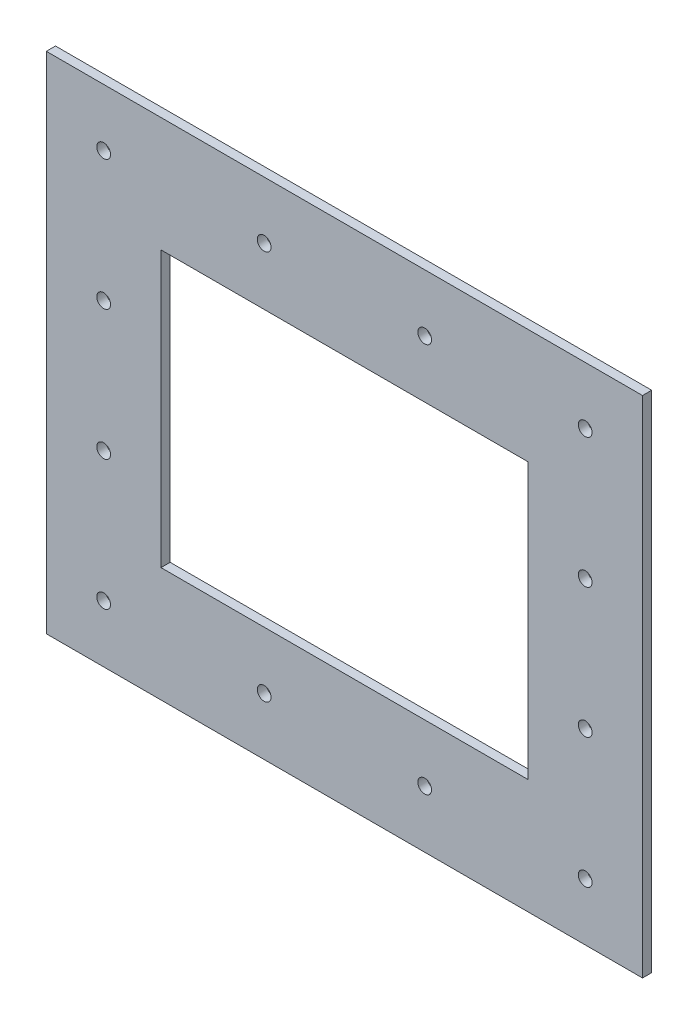
ISO-10303-21;
HEADER;
FILE_DESCRIPTION(('STEP AP214'),'2;1');
FILE_NAME('part.step','',(''),(''),'','','');
FILE_SCHEMA(('AUTOMOTIVE_DESIGN { 1 0 10303 214 1 1 1 1 }'));
ENDSEC;
DATA;
#1=APPLICATION_CONTEXT('core data for automotive mechanical design processes');
#2=APPLICATION_PROTOCOL_DEFINITION('international standard','automotive_design',2000,#1);
#3=PRODUCT_CONTEXT('',#1,'mechanical');
#4=PRODUCT('Part','Part','',(#3));
#5=PRODUCT_RELATED_PRODUCT_CATEGORY('part','',(#4));
#6=PRODUCT_DEFINITION_FORMATION('','',#4);
#7=PRODUCT_DEFINITION_CONTEXT('part definition',#1,'design');
#8=PRODUCT_DEFINITION('design','',#6,#7);
#9=PRODUCT_DEFINITION_SHAPE('','',#8);
#10=(LENGTH_UNIT() NAMED_UNIT(*) SI_UNIT(.MILLI.,.METRE.));
#11=(NAMED_UNIT(*) PLANE_ANGLE_UNIT() SI_UNIT($,.RADIAN.));
#12=(NAMED_UNIT(*) SI_UNIT($,.STERADIAN.) SOLID_ANGLE_UNIT());
#13=UNCERTAINTY_MEASURE_WITH_UNIT(LENGTH_MEASURE(1.E-05),#10,'distance_accuracy_value','');
#14=(GEOMETRIC_REPRESENTATION_CONTEXT(3) GLOBAL_UNCERTAINTY_ASSIGNED_CONTEXT((#13)) GLOBAL_UNIT_ASSIGNED_CONTEXT((#10,
#11,#12)) REPRESENTATION_CONTEXT('',''));
#15=CARTESIAN_POINT('',(0.,0.,0.));
#16=DIRECTION('',(0.,0.,1.));
#17=DIRECTION('',(1.,0.,0.));
#18=AXIS2_PLACEMENT_3D('',#15,#16,#17);
#19=CARTESIAN_POINT('',(0.,0.,2.));
#20=DIRECTION('',(0.,0.,-1.));
#21=DIRECTION('',(-1.,0.,0.));
#22=AXIS2_PLACEMENT_3D('',#19,#20,#21);
#23=PLANE('',#22);
#24=CARTESIAN_POINT('',(47.5000000000001,12.5,2.));
#25=DIRECTION('',(0.,0.,1.));
#26=DIRECTION('',(-1.,0.,0.));
#27=AXIS2_PLACEMENT_3D('',#24,#25,#26);
#28=CIRCLE('',#27,1.5);
#29=CARTESIAN_POINT('',(46.0000000000001,12.5,2.));
#30=VERTEX_POINT('',#29);
#31=EDGE_CURVE('E350',#30,#30,#28,.T.);
#32=ORIENTED_EDGE('',*,*,#31,.F.);
#33=EDGE_LOOP('',(#32));
#34=FACE_BOUND('',#33,.T.);
#35=CARTESIAN_POINT('',(82.5000000000002,12.5,2.));
#36=DIRECTION('',(0.,0.,1.));
#37=DIRECTION('',(-1.,0.,0.));
#38=AXIS2_PLACEMENT_3D('',#35,#36,#37);
#39=CIRCLE('',#38,1.5);
#40=CARTESIAN_POINT('',(81.0000000000002,12.5,2.));
#41=VERTEX_POINT('',#40);
#42=EDGE_CURVE('E342',#41,#41,#39,.T.);
#43=ORIENTED_EDGE('',*,*,#42,.F.);
#44=EDGE_LOOP('',(#43));
#45=FACE_BOUND('',#44,.T.);
#46=CARTESIAN_POINT('',(12.5000000000007,40.84,2.));
#47=DIRECTION('',(0.,0.,1.));
#48=DIRECTION('',(1.,0.,0.));
#49=AXIS2_PLACEMENT_3D('',#46,#47,#48);
#50=CIRCLE('',#49,1.5);
#51=CARTESIAN_POINT('',(14.0000000000007,40.84,2.));
#52=VERTEX_POINT('',#51);
#53=EDGE_CURVE('E334',#52,#52,#50,.T.);
#54=ORIENTED_EDGE('',*,*,#53,.F.);
#55=EDGE_LOOP('',(#54));
#56=FACE_BOUND('',#55,.T.);
#57=CARTESIAN_POINT('',(12.5000000000004,69.17,2.));
#58=DIRECTION('',(0.,0.,1.));
#59=DIRECTION('',(1.,0.,0.));
#60=AXIS2_PLACEMENT_3D('',#57,#58,#59);
#61=CIRCLE('',#60,1.5);
#62=CARTESIAN_POINT('',(14.0000000000004,69.17,2.));
#63=VERTEX_POINT('',#62);
#64=EDGE_CURVE('E325',#63,#63,#61,.T.);
#65=ORIENTED_EDGE('',*,*,#64,.F.);
#66=EDGE_LOOP('',(#65));
#67=FACE_BOUND('',#66,.T.);
#68=CARTESIAN_POINT('',(117.5,12.5,2.));
#69=DIRECTION('',(0.,0.,1.));
#70=DIRECTION('',(-1.,0.,0.));
#71=AXIS2_PLACEMENT_3D('',#68,#69,#70);
#72=CIRCLE('',#71,1.5);
#73=CARTESIAN_POINT('',(116.,12.5,2.));
#74=VERTEX_POINT('',#73);
#75=EDGE_CURVE('E373',#74,#74,#72,.T.);
#76=ORIENTED_EDGE('',*,*,#75,.F.);
#77=EDGE_LOOP('',(#76));
#78=FACE_BOUND('',#77,.T.);
#79=CARTESIAN_POINT('',(47.5000000000001,97.5,2.));
#80=DIRECTION('',(0.,0.,1.));
#81=DIRECTION('',(1.,0.,0.));
#82=AXIS2_PLACEMENT_3D('',#79,#80,#81);
#83=CIRCLE('',#82,1.5);
#84=CARTESIAN_POINT('',(49.0000000000001,97.5,2.));
#85=VERTEX_POINT('',#84);
#86=EDGE_CURVE('E382',#85,#85,#83,.T.);
#87=ORIENTED_EDGE('',*,*,#86,.F.);
#88=EDGE_LOOP('',(#87));
#89=FACE_BOUND('',#88,.T.);
#90=CARTESIAN_POINT('',(82.5000000000001,97.5,2.));
#91=DIRECTION('',(0.,0.,1.));
#92=DIRECTION('',(1.,0.,0.));
#93=AXIS2_PLACEMENT_3D('',#90,#91,#92);
#94=CIRCLE('',#93,1.5);
#95=CARTESIAN_POINT('',(84.0000000000001,97.5,2.));
#96=VERTEX_POINT('',#95);
#97=EDGE_CURVE('E357',#96,#96,#94,.T.);
#98=ORIENTED_EDGE('',*,*,#97,.F.);
#99=EDGE_LOOP('',(#98));
#100=FACE_BOUND('',#99,.T.);
#101=CARTESIAN_POINT('',(117.5,97.5,2.));
#102=DIRECTION('',(0.,0.,1.));
#103=DIRECTION('',(1.,0.,0.));
#104=AXIS2_PLACEMENT_3D('',#101,#102,#103);
#105=CIRCLE('',#104,1.5);
#106=CARTESIAN_POINT('',(119.,97.5,2.));
#107=VERTEX_POINT('',#106);
#108=EDGE_CURVE('E366',#107,#107,#105,.T.);
#109=ORIENTED_EDGE('',*,*,#108,.F.);
#110=EDGE_LOOP('',(#109));
#111=FACE_BOUND('',#110,.T.);
#112=CARTESIAN_POINT('',(12.5000000000001,12.5,2.));
#113=DIRECTION('',(0.,0.,1.));
#114=DIRECTION('',(-1.,0.,0.));
#115=AXIS2_PLACEMENT_3D('',#112,#113,#114);
#116=CIRCLE('',#115,1.5);
#117=CARTESIAN_POINT('',(11.0000000000001,12.5,2.));
#118=VERTEX_POINT('',#117);
#119=EDGE_CURVE('E298',#118,#118,#116,.T.);
#120=ORIENTED_EDGE('',*,*,#119,.F.);
#121=EDGE_LOOP('',(#120));
#122=FACE_BOUND('',#121,.T.);
#123=CARTESIAN_POINT('',(117.499999999999,40.84,2.));
#124=DIRECTION('',(0.,0.,1.));
#125=DIRECTION('',(-1.,0.,0.));
#126=AXIS2_PLACEMENT_3D('',#123,#124,#125);
#127=CIRCLE('',#126,1.50000000000001);
#128=CARTESIAN_POINT('',(115.999999999999,40.84,2.));
#129=VERTEX_POINT('',#128);
#130=EDGE_CURVE('E304',#129,#129,#127,.T.);
#131=ORIENTED_EDGE('',*,*,#130,.F.);
#132=EDGE_LOOP('',(#131));
#133=FACE_BOUND('',#132,.T.);
#134=CARTESIAN_POINT('',(117.5,69.17,2.));
#135=DIRECTION('',(0.,0.,1.));
#136=DIRECTION('',(-1.,0.,0.));
#137=AXIS2_PLACEMENT_3D('',#134,#135,#136);
#138=CIRCLE('',#137,1.5);
#139=CARTESIAN_POINT('',(116.,69.17,2.));
#140=VERTEX_POINT('',#139);
#141=EDGE_CURVE('E317',#140,#140,#138,.T.);
#142=ORIENTED_EDGE('',*,*,#141,.F.);
#143=EDGE_LOOP('',(#142));
#144=FACE_BOUND('',#143,.T.);
#145=CARTESIAN_POINT('',(12.5000000000001,97.5,2.));
#146=DIRECTION('',(0.,0.,1.));
#147=DIRECTION('',(1.,0.,0.));
#148=AXIS2_PLACEMENT_3D('',#145,#146,#147);
#149=CIRCLE('',#148,1.5);
#150=CARTESIAN_POINT('',(14.0000000000001,97.5,2.));
#151=VERTEX_POINT('',#150);
#152=EDGE_CURVE('E139',#151,#151,#149,.T.);
#153=ORIENTED_EDGE('',*,*,#152,.F.);
#154=EDGE_LOOP('',(#153));
#155=FACE_BOUND('',#154,.T.);
#156=DIRECTION('',(0.,-1.,0.));
#157=VECTOR('',#156,1.);
#158=CARTESIAN_POINT('',(0.,0.,2.));
#159=LINE('',#158,#157);
#160=CARTESIAN_POINT('',(0.,110.,2.));
#161=VERTEX_POINT('',#160);
#162=CARTESIAN_POINT('',(0.,0.,2.));
#163=VERTEX_POINT('',#162);
#164=EDGE_CURVE('E155',#161,#163,#159,.T.);
#165=ORIENTED_EDGE('',*,*,#164,.T.);
#166=DIRECTION('',(1.,0.,0.));
#167=VECTOR('',#166,1.);
#168=CARTESIAN_POINT('',(0.,0.,2.));
#169=LINE('',#168,#167);
#170=CARTESIAN_POINT('',(130.,0.,2.));
#171=VERTEX_POINT('',#170);
#172=EDGE_CURVE('E159',#163,#171,#169,.T.);
#173=ORIENTED_EDGE('',*,*,#172,.T.);
#174=DIRECTION('',(0.,1.,0.));
#175=VECTOR('',#174,1.);
#176=CARTESIAN_POINT('',(130.,0.,2.));
#177=LINE('',#176,#175);
#178=CARTESIAN_POINT('',(130.,110.,2.));
#179=VERTEX_POINT('',#178);
#180=EDGE_CURVE('E163',#171,#179,#177,.T.);
#181=ORIENTED_EDGE('',*,*,#180,.T.);
#182=DIRECTION('',(-1.,0.,0.));
#183=VECTOR('',#182,1.);
#184=CARTESIAN_POINT('',(0.,110.,2.));
#185=LINE('',#184,#183);
#186=EDGE_CURVE('E166',#179,#161,#185,.T.);
#187=ORIENTED_EDGE('',*,*,#186,.T.);
#188=EDGE_LOOP('',(#165,#173,#181,#187));
#189=FACE_BOUND('',#188,.T.);
#190=DIRECTION('',(1.,0.,0.));
#191=VECTOR('',#190,1.);
#192=CARTESIAN_POINT('',(25.,25.,2.));
#193=LINE('',#192,#191);
#194=CARTESIAN_POINT('',(25.,25.,2.));
#195=VERTEX_POINT('',#194);
#196=CARTESIAN_POINT('',(105.,25.,2.));
#197=VERTEX_POINT('',#196);
#198=EDGE_CURVE('E105',#195,#197,#193,.T.);
#199=ORIENTED_EDGE('',*,*,#198,.F.);
#200=DIRECTION('',(0.,-1.,0.));
#201=VECTOR('',#200,1.);
#202=CARTESIAN_POINT('',(25.,25.,2.));
#203=LINE('',#202,#201);
#204=CARTESIAN_POINT('',(25.,85.,2.));
#205=VERTEX_POINT('',#204);
#206=EDGE_CURVE('E131',#205,#195,#203,.T.);
#207=ORIENTED_EDGE('',*,*,#206,.F.);
#208=DIRECTION('',(-1.,0.,0.));
#209=VECTOR('',#208,1.);
#210=CARTESIAN_POINT('',(25.,85.,2.));
#211=LINE('',#210,#209);
#212=CARTESIAN_POINT('',(105.,85.,2.));
#213=VERTEX_POINT('',#212);
#214=EDGE_CURVE('E127',#213,#205,#211,.T.);
#215=ORIENTED_EDGE('',*,*,#214,.F.);
#216=DIRECTION('',(0.,1.,0.));
#217=VECTOR('',#216,1.);
#218=CARTESIAN_POINT('',(105.,25.,2.));
#219=LINE('',#218,#217);
#220=EDGE_CURVE('E114',#197,#213,#219,.T.);
#221=ORIENTED_EDGE('',*,*,#220,.F.);
#222=EDGE_LOOP('',(#199,#207,#215,#221));
#223=FACE_BOUND('',#222,.T.);
#224=ADVANCED_FACE('F39',(#34,#45,#56,#67,#78,#89,#100,#111,#122,#133,#144,#155,#189,#223),#23,.F.);
#225=CARTESIAN_POINT('',(0.,0.,0.));
#226=DIRECTION('',(0.,0.,-1.));
#227=DIRECTION('',(-1.,0.,0.));
#228=AXIS2_PLACEMENT_3D('',#225,#226,#227);
#229=PLANE('',#228);
#230=CARTESIAN_POINT('',(47.5000000000001,12.5,0.));
#231=DIRECTION('',(0.,0.,1.));
#232=DIRECTION('',(-1.,0.,0.));
#233=AXIS2_PLACEMENT_3D('',#230,#231,#232);
#234=CIRCLE('',#233,1.5);
#235=CARTESIAN_POINT('',(46.0000000000001,12.5,0.));
#236=VERTEX_POINT('',#235);
#237=EDGE_CURVE('E308',#236,#236,#234,.T.);
#238=ORIENTED_EDGE('',*,*,#237,.T.);
#239=EDGE_LOOP('',(#238));
#240=FACE_BOUND('',#239,.T.);
#241=CARTESIAN_POINT('',(82.5000000000002,12.5,0.));
#242=DIRECTION('',(0.,0.,1.));
#243=DIRECTION('',(-1.,0.,0.));
#244=AXIS2_PLACEMENT_3D('',#241,#242,#243);
#245=CIRCLE('',#244,1.5);
#246=CARTESIAN_POINT('',(81.0000000000002,12.5,0.));
#247=VERTEX_POINT('',#246);
#248=EDGE_CURVE('E346',#247,#247,#245,.T.);
#249=ORIENTED_EDGE('',*,*,#248,.T.);
#250=EDGE_LOOP('',(#249));
#251=FACE_BOUND('',#250,.T.);
#252=CARTESIAN_POINT('',(12.5000000000007,40.84,0.));
#253=DIRECTION('',(0.,0.,1.));
#254=DIRECTION('',(1.,0.,0.));
#255=AXIS2_PLACEMENT_3D('',#252,#253,#254);
#256=CIRCLE('',#255,1.5);
#257=CARTESIAN_POINT('',(14.0000000000007,40.84,0.));
#258=VERTEX_POINT('',#257);
#259=EDGE_CURVE('E338',#258,#258,#256,.T.);
#260=ORIENTED_EDGE('',*,*,#259,.T.);
#261=EDGE_LOOP('',(#260));
#262=FACE_BOUND('',#261,.T.);
#263=CARTESIAN_POINT('',(12.5000000000004,69.17,0.));
#264=DIRECTION('',(0.,0.,1.));
#265=DIRECTION('',(1.,0.,0.));
#266=AXIS2_PLACEMENT_3D('',#263,#264,#265);
#267=CIRCLE('',#266,1.5);
#268=CARTESIAN_POINT('',(14.0000000000004,69.17,0.));
#269=VERTEX_POINT('',#268);
#270=EDGE_CURVE('E330',#269,#269,#267,.T.);
#271=ORIENTED_EDGE('',*,*,#270,.T.);
#272=EDGE_LOOP('',(#271));
#273=FACE_BOUND('',#272,.T.);
#274=CARTESIAN_POINT('',(117.5,12.5,0.));
#275=DIRECTION('',(0.,0.,1.));
#276=DIRECTION('',(-1.,0.,0.));
#277=AXIS2_PLACEMENT_3D('',#274,#275,#276);
#278=CIRCLE('',#277,1.5);
#279=CARTESIAN_POINT('',(116.,12.5,0.));
#280=VERTEX_POINT('',#279);
#281=EDGE_CURVE('E378',#280,#280,#278,.T.);
#282=ORIENTED_EDGE('',*,*,#281,.T.);
#283=EDGE_LOOP('',(#282));
#284=FACE_BOUND('',#283,.T.);
#285=CARTESIAN_POINT('',(47.5000000000001,97.5,0.));
#286=DIRECTION('',(0.,0.,1.));
#287=DIRECTION('',(1.,0.,0.));
#288=AXIS2_PLACEMENT_3D('',#285,#286,#287);
#289=CIRCLE('',#288,1.5);
#290=CARTESIAN_POINT('',(49.0000000000001,97.5,0.));
#291=VERTEX_POINT('',#290);
#292=EDGE_CURVE('E361',#291,#291,#289,.T.);
#293=ORIENTED_EDGE('',*,*,#292,.T.);
#294=EDGE_LOOP('',(#293));
#295=FACE_BOUND('',#294,.T.);
#296=CARTESIAN_POINT('',(82.5000000000001,97.5,0.));
#297=DIRECTION('',(0.,0.,1.));
#298=DIRECTION('',(1.,0.,0.));
#299=AXIS2_PLACEMENT_3D('',#296,#297,#298);
#300=CIRCLE('',#299,1.5);
#301=CARTESIAN_POINT('',(84.0000000000001,97.5,0.));
#302=VERTEX_POINT('',#301);
#303=EDGE_CURVE('E362',#302,#302,#300,.T.);
#304=ORIENTED_EDGE('',*,*,#303,.T.);
#305=EDGE_LOOP('',(#304));
#306=FACE_BOUND('',#305,.T.);
#307=CARTESIAN_POINT('',(117.5,97.5,0.));
#308=DIRECTION('',(0.,0.,1.));
#309=DIRECTION('',(1.,0.,0.));
#310=AXIS2_PLACEMENT_3D('',#307,#308,#309);
#311=CIRCLE('',#310,1.5);
#312=CARTESIAN_POINT('',(119.,97.5,0.));
#313=VERTEX_POINT('',#312);
#314=EDGE_CURVE('E329',#313,#313,#311,.T.);
#315=ORIENTED_EDGE('',*,*,#314,.T.);
#316=EDGE_LOOP('',(#315));
#317=FACE_BOUND('',#316,.T.);
#318=CARTESIAN_POINT('',(12.5000000000001,12.5,0.));
#319=DIRECTION('',(0.,0.,1.));
#320=DIRECTION('',(-1.,0.,0.));
#321=AXIS2_PLACEMENT_3D('',#318,#319,#320);
#322=CIRCLE('',#321,1.5);
#323=CARTESIAN_POINT('',(11.0000000000001,12.5,0.));
#324=VERTEX_POINT('',#323);
#325=EDGE_CURVE('E301',#324,#324,#322,.T.);
#326=ORIENTED_EDGE('',*,*,#325,.T.);
#327=EDGE_LOOP('',(#326));
#328=FACE_BOUND('',#327,.T.);
#329=CARTESIAN_POINT('',(117.499999999999,40.84,0.));
#330=DIRECTION('',(0.,0.,1.));
#331=DIRECTION('',(-1.,0.,0.));
#332=AXIS2_PLACEMENT_3D('',#329,#330,#331);
#333=CIRCLE('',#332,1.50000000000001);
#334=CARTESIAN_POINT('',(115.999999999999,40.84,0.));
#335=VERTEX_POINT('',#334);
#336=EDGE_CURVE('E311',#335,#335,#333,.T.);
#337=ORIENTED_EDGE('',*,*,#336,.T.);
#338=EDGE_LOOP('',(#337));
#339=FACE_BOUND('',#338,.T.);
#340=CARTESIAN_POINT('',(117.5,69.17,0.));
#341=DIRECTION('',(0.,0.,1.));
#342=DIRECTION('',(-1.,0.,0.));
#343=AXIS2_PLACEMENT_3D('',#340,#341,#342);
#344=CIRCLE('',#343,1.5);
#345=CARTESIAN_POINT('',(116.,69.17,0.));
#346=VERTEX_POINT('',#345);
#347=EDGE_CURVE('E321',#346,#346,#344,.T.);
#348=ORIENTED_EDGE('',*,*,#347,.T.);
#349=EDGE_LOOP('',(#348));
#350=FACE_BOUND('',#349,.T.);
#351=CARTESIAN_POINT('',(12.5000000000001,97.5,0.));
#352=DIRECTION('',(0.,0.,1.));
#353=DIRECTION('',(1.,0.,0.));
#354=AXIS2_PLACEMENT_3D('',#351,#352,#353);
#355=CIRCLE('',#354,1.5);
#356=CARTESIAN_POINT('',(14.0000000000001,97.5,0.));
#357=VERTEX_POINT('',#356);
#358=EDGE_CURVE('E377',#357,#357,#355,.T.);
#359=ORIENTED_EDGE('',*,*,#358,.T.);
#360=EDGE_LOOP('',(#359));
#361=FACE_BOUND('',#360,.T.);
#362=DIRECTION('',(0.,-1.,0.));
#363=VECTOR('',#362,1.);
#364=CARTESIAN_POINT('',(0.,0.,0.));
#365=LINE('',#364,#363);
#366=CARTESIAN_POINT('',(0.,110.,0.));
#367=VERTEX_POINT('',#366);
#368=CARTESIAN_POINT('',(0.,0.,0.));
#369=VERTEX_POINT('',#368);
#370=EDGE_CURVE('E123',#367,#369,#365,.T.);
#371=ORIENTED_EDGE('',*,*,#370,.F.);
#372=DIRECTION('',(-1.,0.,0.));
#373=VECTOR('',#372,1.);
#374=CARTESIAN_POINT('',(0.,110.,0.));
#375=LINE('',#374,#373);
#376=CARTESIAN_POINT('',(130.,110.,0.));
#377=VERTEX_POINT('',#376);
#378=EDGE_CURVE('E160',#377,#367,#375,.T.);
#379=ORIENTED_EDGE('',*,*,#378,.F.);
#380=DIRECTION('',(0.,1.,0.));
#381=VECTOR('',#380,1.);
#382=CARTESIAN_POINT('',(130.,0.,0.));
#383=LINE('',#382,#381);
#384=CARTESIAN_POINT('',(130.,0.,0.));
#385=VERTEX_POINT('',#384);
#386=EDGE_CURVE('E176',#385,#377,#383,.T.);
#387=ORIENTED_EDGE('',*,*,#386,.F.);
#388=DIRECTION('',(1.,0.,0.));
#389=VECTOR('',#388,1.);
#390=CARTESIAN_POINT('',(0.,0.,0.));
#391=LINE('',#390,#389);
#392=EDGE_CURVE('E173',#369,#385,#391,.T.);
#393=ORIENTED_EDGE('',*,*,#392,.F.);
#394=EDGE_LOOP('',(#371,#379,#387,#393));
#395=FACE_BOUND('',#394,.T.);
#396=DIRECTION('',(0.,-1.,0.));
#397=VECTOR('',#396,1.);
#398=CARTESIAN_POINT('',(25.,25.,0.));
#399=LINE('',#398,#397);
#400=CARTESIAN_POINT('',(25.,85.,0.));
#401=VERTEX_POINT('',#400);
#402=CARTESIAN_POINT('',(25.,25.,0.));
#403=VERTEX_POINT('',#402);
#404=EDGE_CURVE('E115',#401,#403,#399,.T.);
#405=ORIENTED_EDGE('',*,*,#404,.T.);
#406=DIRECTION('',(1.,0.,0.));
#407=VECTOR('',#406,1.);
#408=CARTESIAN_POINT('',(25.,25.,0.));
#409=LINE('',#408,#407);
#410=CARTESIAN_POINT('',(105.,25.,0.));
#411=VERTEX_POINT('',#410);
#412=EDGE_CURVE('E63',#403,#411,#409,.T.);
#413=ORIENTED_EDGE('',*,*,#412,.T.);
#414=DIRECTION('',(0.,1.,0.));
#415=VECTOR('',#414,1.);
#416=CARTESIAN_POINT('',(105.,25.,0.));
#417=LINE('',#416,#415);
#418=CARTESIAN_POINT('',(105.,85.,0.));
#419=VERTEX_POINT('',#418);
#420=EDGE_CURVE('E121',#411,#419,#417,.T.);
#421=ORIENTED_EDGE('',*,*,#420,.T.);
#422=DIRECTION('',(-1.,0.,0.));
#423=VECTOR('',#422,1.);
#424=CARTESIAN_POINT('',(25.,85.,0.));
#425=LINE('',#424,#423);
#426=EDGE_CURVE('E142',#419,#401,#425,.T.);
#427=ORIENTED_EDGE('',*,*,#426,.T.);
#428=EDGE_LOOP('',(#405,#413,#421,#427));
#429=FACE_BOUND('',#428,.T.);
#430=ADVANCED_FACE('F199',(#240,#251,#262,#273,#284,#295,#306,#317,#328,#339,#350,#361,#395,
#429),#229,.T.);
#431=CARTESIAN_POINT('',(0.,0.,2.));
#432=DIRECTION('',(1.,0.,0.));
#433=DIRECTION('',(0.,1.,0.));
#434=AXIS2_PLACEMENT_3D('',#431,#432,#433);
#435=PLANE('',#434);
#436=ORIENTED_EDGE('',*,*,#370,.T.);
#437=DIRECTION('',(0.,0.,-1.));
#438=VECTOR('',#437,1.);
#439=CARTESIAN_POINT('',(0.,0.,2.));
#440=LINE('',#439,#438);
#441=EDGE_CURVE('E11',#163,#369,#440,.T.);
#442=ORIENTED_EDGE('',*,*,#441,.F.);
#443=ORIENTED_EDGE('',*,*,#164,.F.);
#444=DIRECTION('',(0.,0.,-1.));
#445=VECTOR('',#444,1.);
#446=CARTESIAN_POINT('',(0.,110.,2.));
#447=LINE('',#446,#445);
#448=EDGE_CURVE('E169',#161,#367,#447,.T.);
#449=ORIENTED_EDGE('',*,*,#448,.T.);
#450=EDGE_LOOP('',(#436,#442,#443,#449));
#451=FACE_BOUND('',#450,.T.);
#452=ADVANCED_FACE('F41',(#451),#435,.F.);
#453=CARTESIAN_POINT('',(0.,0.,2.));
#454=DIRECTION('',(0.,1.,0.));
#455=DIRECTION('',(0.,0.,1.));
#456=AXIS2_PLACEMENT_3D('',#453,#454,#455);
#457=PLANE('',#456);
#458=ORIENTED_EDGE('',*,*,#392,.T.);
#459=DIRECTION('',(0.,0.,-1.));
#460=VECTOR('',#459,1.);
#461=CARTESIAN_POINT('',(130.,0.,2.));
#462=LINE('',#461,#460);
#463=EDGE_CURVE('E48',#171,#385,#462,.T.);
#464=ORIENTED_EDGE('',*,*,#463,.F.);
#465=ORIENTED_EDGE('',*,*,#172,.F.);
#466=ORIENTED_EDGE('',*,*,#441,.T.);
#467=EDGE_LOOP('',(#458,#464,#465,#466));
#468=FACE_BOUND('',#467,.T.);
#469=ADVANCED_FACE('F209',(#468),#457,.F.);
#470=CARTESIAN_POINT('',(130.,0.,2.));
#471=DIRECTION('',(-1.,0.,0.));
#472=DIRECTION('',(0.,-1.,0.));
#473=AXIS2_PLACEMENT_3D('',#470,#471,#472);
#474=PLANE('',#473);
#475=ORIENTED_EDGE('',*,*,#386,.T.);
#476=DIRECTION('',(0.,0.,-1.));
#477=VECTOR('',#476,1.);
#478=CARTESIAN_POINT('',(130.,110.,2.));
#479=LINE('',#478,#477);
#480=EDGE_CURVE('E184',#179,#377,#479,.T.);
#481=ORIENTED_EDGE('',*,*,#480,.F.);
#482=ORIENTED_EDGE('',*,*,#180,.F.);
#483=ORIENTED_EDGE('',*,*,#463,.T.);
#484=EDGE_LOOP('',(#475,#481,#482,#483));
#485=FACE_BOUND('',#484,.T.);
#486=ADVANCED_FACE('F193',(#485),#474,.F.);
#487=CARTESIAN_POINT('',(0.,110.,2.));
#488=DIRECTION('',(0.,-1.,0.));
#489=DIRECTION('',(0.,0.,-1.));
#490=AXIS2_PLACEMENT_3D('',#487,#488,#489);
#491=PLANE('',#490);
#492=ORIENTED_EDGE('',*,*,#378,.T.);
#493=ORIENTED_EDGE('',*,*,#448,.F.);
#494=ORIENTED_EDGE('',*,*,#186,.F.);
#495=ORIENTED_EDGE('',*,*,#480,.T.);
#496=EDGE_LOOP('',(#492,#493,#494,#495));
#497=FACE_BOUND('',#496,.T.);
#498=ADVANCED_FACE('F203',(#497),#491,.F.);
#499=CARTESIAN_POINT('',(25.,25.,2.));
#500=DIRECTION('',(0.,1.,0.));
#501=DIRECTION('',(0.,0.,1.));
#502=AXIS2_PLACEMENT_3D('',#499,#500,#501);
#503=PLANE('',#502);
#504=ORIENTED_EDGE('',*,*,#412,.F.);
#505=DIRECTION('',(0.,0.,-1.));
#506=VECTOR('',#505,1.);
#507=CARTESIAN_POINT('',(25.,25.,2.));
#508=LINE('',#507,#506);
#509=EDGE_CURVE('E109',#195,#403,#508,.T.);
#510=ORIENTED_EDGE('',*,*,#509,.F.);
#511=ORIENTED_EDGE('',*,*,#198,.T.);
#512=DIRECTION('',(0.,0.,-1.));
#513=VECTOR('',#512,1.);
#514=CARTESIAN_POINT('',(105.,25.,2.));
#515=LINE('',#514,#513);
#516=EDGE_CURVE('E108',#197,#411,#515,.T.);
#517=ORIENTED_EDGE('',*,*,#516,.T.);
#518=EDGE_LOOP('',(#504,#510,#511,#517));
#519=FACE_BOUND('',#518,.T.);
#520=ADVANCED_FACE('F107',(#519),#503,.T.);
#521=CARTESIAN_POINT('',(105.,25.,2.));
#522=DIRECTION('',(-1.,0.,0.));
#523=DIRECTION('',(0.,-1.,0.));
#524=AXIS2_PLACEMENT_3D('',#521,#522,#523);
#525=PLANE('',#524);
#526=ORIENTED_EDGE('',*,*,#420,.F.);
#527=ORIENTED_EDGE('',*,*,#516,.F.);
#528=ORIENTED_EDGE('',*,*,#220,.T.);
#529=DIRECTION('',(0.,0.,-1.));
#530=VECTOR('',#529,1.);
#531=CARTESIAN_POINT('',(105.,85.,2.));
#532=LINE('',#531,#530);
#533=EDGE_CURVE('E124',#213,#419,#532,.T.);
#534=ORIENTED_EDGE('',*,*,#533,.T.);
#535=EDGE_LOOP('',(#526,#527,#528,#534));
#536=FACE_BOUND('',#535,.T.);
#537=ADVANCED_FACE('F118',(#536),#525,.T.);
#538=CARTESIAN_POINT('',(25.,85.,2.));
#539=DIRECTION('',(0.,-1.,0.));
#540=DIRECTION('',(0.,0.,-1.));
#541=AXIS2_PLACEMENT_3D('',#538,#539,#540);
#542=PLANE('',#541);
#543=ORIENTED_EDGE('',*,*,#426,.F.);
#544=ORIENTED_EDGE('',*,*,#533,.F.);
#545=ORIENTED_EDGE('',*,*,#214,.T.);
#546=DIRECTION('',(0.,0.,-1.));
#547=VECTOR('',#546,1.);
#548=CARTESIAN_POINT('',(25.,85.,2.));
#549=LINE('',#548,#547);
#550=EDGE_CURVE('E55',#205,#401,#549,.T.);
#551=ORIENTED_EDGE('',*,*,#550,.T.);
#552=EDGE_LOOP('',(#543,#544,#545,#551));
#553=FACE_BOUND('',#552,.T.);
#554=ADVANCED_FACE('F236',(#553),#542,.T.);
#555=CARTESIAN_POINT('',(25.,25.,2.));
#556=DIRECTION('',(1.,0.,0.));
#557=DIRECTION('',(0.,0.,-1.));
#558=AXIS2_PLACEMENT_3D('',#555,#556,#557);
#559=PLANE('',#558);
#560=ORIENTED_EDGE('',*,*,#404,.F.);
#561=ORIENTED_EDGE('',*,*,#550,.F.);
#562=ORIENTED_EDGE('',*,*,#206,.T.);
#563=ORIENTED_EDGE('',*,*,#509,.T.);
#564=EDGE_LOOP('',(#560,#561,#562,#563));
#565=FACE_BOUND('',#564,.T.);
#566=ADVANCED_FACE('F240',(#565),#559,.T.);
#567=CARTESIAN_POINT('',(12.5000000000001,97.5,2.));
#568=DIRECTION('',(0.,0.,-1.));
#569=DIRECTION('',(-1.,0.,0.));
#570=AXIS2_PLACEMENT_3D('',#567,#568,#569);
#571=CYLINDRICAL_SURFACE('',#570,1.5);
#572=ORIENTED_EDGE('',*,*,#152,.T.);
#573=EDGE_LOOP('',(#572));
#574=FACE_BOUND('',#573,.T.);
#575=ORIENTED_EDGE('',*,*,#358,.F.);
#576=EDGE_LOOP('',(#575));
#577=FACE_BOUND('',#576,.T.);
#578=ADVANCED_FACE('F246',(#574,#577),#571,.F.);
#579=CARTESIAN_POINT('',(117.5,69.17,2.));
#580=DIRECTION('',(0.,0.,-1.));
#581=DIRECTION('',(-1.,0.,0.));
#582=AXIS2_PLACEMENT_3D('',#579,#580,#581);
#583=CYLINDRICAL_SURFACE('',#582,1.5);
#584=ORIENTED_EDGE('',*,*,#141,.T.);
#585=EDGE_LOOP('',(#584));
#586=FACE_BOUND('',#585,.T.);
#587=ORIENTED_EDGE('',*,*,#347,.F.);
#588=EDGE_LOOP('',(#587));
#589=FACE_BOUND('',#588,.T.);
#590=ADVANCED_FACE('F249',(#586,#589),#583,.F.);
#591=CARTESIAN_POINT('',(117.499999999999,40.84,2.));
#592=DIRECTION('',(0.,0.,-1.));
#593=DIRECTION('',(-1.,0.,0.));
#594=AXIS2_PLACEMENT_3D('',#591,#592,#593);
#595=CYLINDRICAL_SURFACE('',#594,1.50000000000001);
#596=ORIENTED_EDGE('',*,*,#130,.T.);
#597=EDGE_LOOP('',(#596));
#598=FACE_BOUND('',#597,.T.);
#599=ORIENTED_EDGE('',*,*,#336,.F.);
#600=EDGE_LOOP('',(#599));
#601=FACE_BOUND('',#600,.T.);
#602=ADVANCED_FACE('F286',(#598,#601),#595,.F.);
#603=CARTESIAN_POINT('',(12.5000000000001,12.5,2.));
#604=DIRECTION('',(0.,0.,-1.));
#605=DIRECTION('',(-1.,0.,0.));
#606=AXIS2_PLACEMENT_3D('',#603,#604,#605);
#607=CYLINDRICAL_SURFACE('',#606,1.5);
#608=ORIENTED_EDGE('',*,*,#119,.T.);
#609=EDGE_LOOP('',(#608));
#610=FACE_BOUND('',#609,.T.);
#611=ORIENTED_EDGE('',*,*,#325,.F.);
#612=EDGE_LOOP('',(#611));
#613=FACE_BOUND('',#612,.T.);
#614=ADVANCED_FACE('F264',(#610,#613),#607,.F.);
#615=CARTESIAN_POINT('',(117.5,97.5,2.));
#616=DIRECTION('',(0.,0.,-1.));
#617=DIRECTION('',(-1.,0.,0.));
#618=AXIS2_PLACEMENT_3D('',#615,#616,#617);
#619=CYLINDRICAL_SURFACE('',#618,1.5);
#620=ORIENTED_EDGE('',*,*,#108,.T.);
#621=EDGE_LOOP('',(#620));
#622=FACE_BOUND('',#621,.T.);
#623=ORIENTED_EDGE('',*,*,#314,.F.);
#624=EDGE_LOOP('',(#623));
#625=FACE_BOUND('',#624,.T.);
#626=ADVANCED_FACE('F261',(#622,#625),#619,.F.);
#627=CARTESIAN_POINT('',(82.5000000000001,97.5,2.));
#628=DIRECTION('',(0.,0.,-1.));
#629=DIRECTION('',(-1.,0.,0.));
#630=AXIS2_PLACEMENT_3D('',#627,#628,#629);
#631=CYLINDRICAL_SURFACE('',#630,1.5);
#632=ORIENTED_EDGE('',*,*,#97,.T.);
#633=EDGE_LOOP('',(#632));
#634=FACE_BOUND('',#633,.T.);
#635=ORIENTED_EDGE('',*,*,#303,.F.);
#636=EDGE_LOOP('',(#635));
#637=FACE_BOUND('',#636,.T.);
#638=ADVANCED_FACE('F255',(#634,#637),#631,.F.);
#639=CARTESIAN_POINT('',(47.5000000000001,97.5,2.));
#640=DIRECTION('',(0.,0.,-1.));
#641=DIRECTION('',(-1.,0.,0.));
#642=AXIS2_PLACEMENT_3D('',#639,#640,#641);
#643=CYLINDRICAL_SURFACE('',#642,1.5);
#644=ORIENTED_EDGE('',*,*,#86,.T.);
#645=EDGE_LOOP('',(#644));
#646=FACE_BOUND('',#645,.T.);
#647=ORIENTED_EDGE('',*,*,#292,.F.);
#648=EDGE_LOOP('',(#647));
#649=FACE_BOUND('',#648,.T.);
#650=ADVANCED_FACE('F251',(#646,#649),#643,.F.);
#651=CARTESIAN_POINT('',(117.5,12.5,2.));
#652=DIRECTION('',(0.,0.,-1.));
#653=DIRECTION('',(-1.,0.,0.));
#654=AXIS2_PLACEMENT_3D('',#651,#652,#653);
#655=CYLINDRICAL_SURFACE('',#654,1.5);
#656=ORIENTED_EDGE('',*,*,#75,.T.);
#657=EDGE_LOOP('',(#656));
#658=FACE_BOUND('',#657,.T.);
#659=ORIENTED_EDGE('',*,*,#281,.F.);
#660=EDGE_LOOP('',(#659));
#661=FACE_BOUND('',#660,.T.);
#662=ADVANCED_FACE('F254',(#658,#661),#655,.F.);
#663=CARTESIAN_POINT('',(12.5000000000004,69.17,2.));
#664=DIRECTION('',(0.,0.,-1.));
#665=DIRECTION('',(-1.,0.,0.));
#666=AXIS2_PLACEMENT_3D('',#663,#664,#665);
#667=CYLINDRICAL_SURFACE('',#666,1.5);
#668=ORIENTED_EDGE('',*,*,#64,.T.);
#669=EDGE_LOOP('',(#668));
#670=FACE_BOUND('',#669,.T.);
#671=ORIENTED_EDGE('',*,*,#270,.F.);
#672=EDGE_LOOP('',(#671));
#673=FACE_BOUND('',#672,.T.);
#674=ADVANCED_FACE('F259',(#670,#673),#667,.F.);
#675=CARTESIAN_POINT('',(12.5000000000007,40.84,2.));
#676=DIRECTION('',(0.,0.,-1.));
#677=DIRECTION('',(-1.,0.,0.));
#678=AXIS2_PLACEMENT_3D('',#675,#676,#677);
#679=CYLINDRICAL_SURFACE('',#678,1.5);
#680=ORIENTED_EDGE('',*,*,#53,.T.);
#681=EDGE_LOOP('',(#680));
#682=FACE_BOUND('',#681,.T.);
#683=ORIENTED_EDGE('',*,*,#259,.F.);
#684=EDGE_LOOP('',(#683));
#685=FACE_BOUND('',#684,.T.);
#686=ADVANCED_FACE('F276',(#682,#685),#679,.F.);
#687=CARTESIAN_POINT('',(82.5000000000002,12.5,2.));
#688=DIRECTION('',(0.,0.,-1.));
#689=DIRECTION('',(-1.,0.,0.));
#690=AXIS2_PLACEMENT_3D('',#687,#688,#689);
#691=CYLINDRICAL_SURFACE('',#690,1.5);
#692=ORIENTED_EDGE('',*,*,#42,.T.);
#693=EDGE_LOOP('',(#692));
#694=FACE_BOUND('',#693,.T.);
#695=ORIENTED_EDGE('',*,*,#248,.F.);
#696=EDGE_LOOP('',(#695));
#697=FACE_BOUND('',#696,.T.);
#698=ADVANCED_FACE('F272',(#694,#697),#691,.F.);
#699=CARTESIAN_POINT('',(47.5000000000001,12.5,2.));
#700=DIRECTION('',(0.,0.,-1.));
#701=DIRECTION('',(-1.,0.,0.));
#702=AXIS2_PLACEMENT_3D('',#699,#700,#701);
#703=CYLINDRICAL_SURFACE('',#702,1.5);
#704=ORIENTED_EDGE('',*,*,#31,.T.);
#705=EDGE_LOOP('',(#704));
#706=FACE_BOUND('',#705,.T.);
#707=ORIENTED_EDGE('',*,*,#237,.F.);
#708=EDGE_LOOP('',(#707));
#709=FACE_BOUND('',#708,.T.);
#710=ADVANCED_FACE('F269',(#706,#709),#703,.F.);
#711=CLOSED_SHELL('',(#224,#430,#452,#469,#486,#498,#520,#537,#554,#566,#578,#590,#602,#614,
#626,#638,#650,#662,#674,#686,#698,#710));
#712=MANIFOLD_SOLID_BREP('B2',#711);
#713=ADVANCED_BREP_SHAPE_REPRESENTATION('',(#18,#712),#14);
#714=SHAPE_DEFINITION_REPRESENTATION(#9,#713);
ENDSEC;
END-ISO-10303-21;
